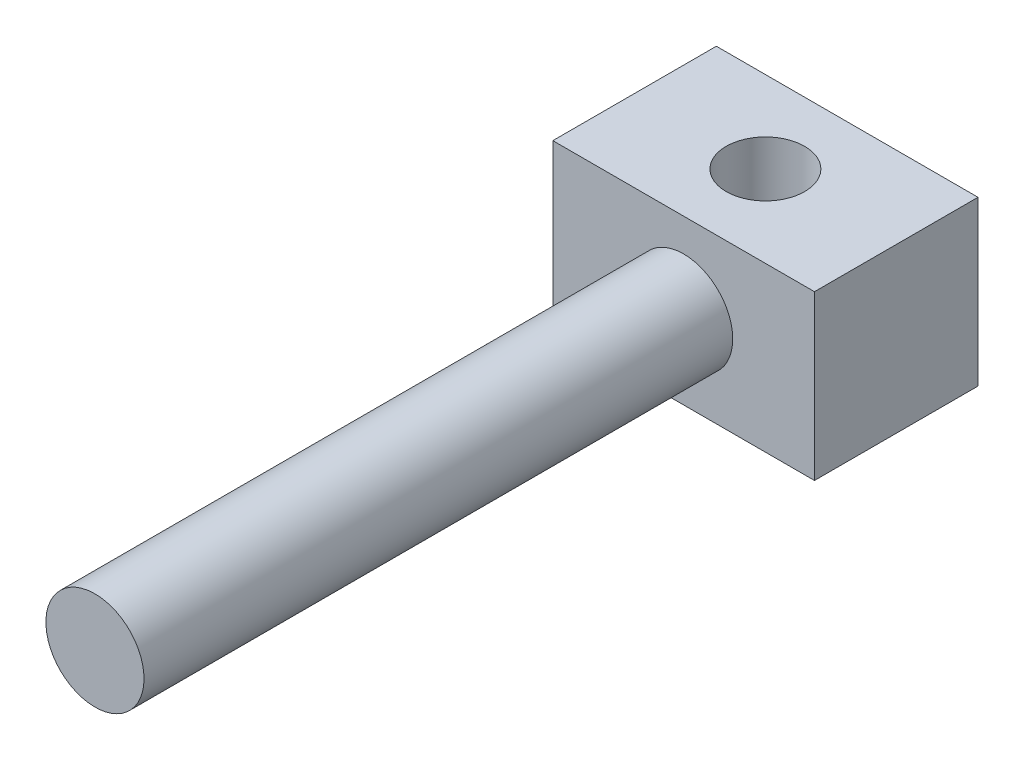
ISO-10303-21;
HEADER;
FILE_DESCRIPTION(('STEP AP214'),'2;1');
FILE_NAME('part.step','',(''),(''),'','','');
FILE_SCHEMA(('AUTOMOTIVE_DESIGN { 1 0 10303 214 1 1 1 1 }'));
ENDSEC;
DATA;
#1=APPLICATION_CONTEXT('core data for automotive mechanical design processes');
#2=APPLICATION_PROTOCOL_DEFINITION('international standard','automotive_design',2000,#1);
#3=PRODUCT_CONTEXT('',#1,'mechanical');
#4=PRODUCT('Part','Part','',(#3));
#5=PRODUCT_RELATED_PRODUCT_CATEGORY('part','',(#4));
#6=PRODUCT_DEFINITION_FORMATION('','',#4);
#7=PRODUCT_DEFINITION_CONTEXT('part definition',#1,'design');
#8=PRODUCT_DEFINITION('design','',#6,#7);
#9=PRODUCT_DEFINITION_SHAPE('','',#8);
#10=(LENGTH_UNIT() NAMED_UNIT(*) SI_UNIT(.MILLI.,.METRE.));
#11=(NAMED_UNIT(*) PLANE_ANGLE_UNIT() SI_UNIT($,.RADIAN.));
#12=(NAMED_UNIT(*) SI_UNIT($,.STERADIAN.) SOLID_ANGLE_UNIT());
#13=UNCERTAINTY_MEASURE_WITH_UNIT(LENGTH_MEASURE(1.E-05),#10,'distance_accuracy_value','');
#14=(GEOMETRIC_REPRESENTATION_CONTEXT(3) GLOBAL_UNCERTAINTY_ASSIGNED_CONTEXT((#13)) GLOBAL_UNIT_ASSIGNED_CONTEXT((#10,
#11,#12)) REPRESENTATION_CONTEXT('',''));
#15=CARTESIAN_POINT('',(0.,0.,0.));
#16=DIRECTION('',(0.,0.,1.));
#17=DIRECTION('',(1.,0.,0.));
#18=AXIS2_PLACEMENT_3D('',#15,#16,#17);
#19=CARTESIAN_POINT('',(-4.,2.5,2.5));
#20=DIRECTION('',(0.,0.,-1.));
#21=DIRECTION('',(-1.,0.,0.));
#22=AXIS2_PLACEMENT_3D('',#19,#20,#21);
#23=PLANE('',#22);
#24=CARTESIAN_POINT('',(0.,0.,2.5));
#25=DIRECTION('',(0.,0.,-1.));
#26=DIRECTION('',(-1.,0.,0.));
#27=AXIS2_PLACEMENT_3D('',#24,#25,#26);
#28=CIRCLE('',#27,1.5);
#29=CARTESIAN_POINT('',(-1.5,0.,2.5));
#30=VERTEX_POINT('',#29);
#31=EDGE_CURVE('E151',#30,#30,#28,.F.);
#32=ORIENTED_EDGE('',*,*,#31,.F.);
#33=EDGE_LOOP('',(#32));
#34=FACE_BOUND('',#33,.T.);
#35=DIRECTION('',(1.,0.,0.));
#36=VECTOR('',#35,1.);
#37=CARTESIAN_POINT('',(-4.,-2.5,2.5));
#38=LINE('',#37,#36);
#39=CARTESIAN_POINT('',(-4.,-2.5,2.5));
#40=VERTEX_POINT('',#39);
#41=CARTESIAN_POINT('',(4.00000000000001,-2.5,2.5));
#42=VERTEX_POINT('',#41);
#43=EDGE_CURVE('E147',#40,#42,#38,.T.);
#44=ORIENTED_EDGE('',*,*,#43,.T.);
#45=DIRECTION('',(0.,-1.,0.));
#46=VECTOR('',#45,1.);
#47=CARTESIAN_POINT('',(4.00000000000001,2.5,2.5));
#48=LINE('',#47,#46);
#49=CARTESIAN_POINT('',(4.00000000000001,2.5,2.5));
#50=VERTEX_POINT('',#49);
#51=EDGE_CURVE('E12',#50,#42,#48,.T.);
#52=ORIENTED_EDGE('',*,*,#51,.F.);
#53=DIRECTION('',(1.,0.,0.));
#54=VECTOR('',#53,1.);
#55=CARTESIAN_POINT('',(-4.,2.5,2.5));
#56=LINE('',#55,#54);
#57=CARTESIAN_POINT('',(-4.,2.5,2.5));
#58=VERTEX_POINT('',#57);
#59=EDGE_CURVE('E131',#58,#50,#56,.T.);
#60=ORIENTED_EDGE('',*,*,#59,.F.);
#61=DIRECTION('',(0.,-1.,0.));
#62=VECTOR('',#61,1.);
#63=CARTESIAN_POINT('',(-4.,2.5,2.5));
#64=LINE('',#63,#62);
#65=EDGE_CURVE('E143',#58,#40,#64,.T.);
#66=ORIENTED_EDGE('',*,*,#65,.T.);
#67=EDGE_LOOP('',(#44,#52,#60,#66));
#68=FACE_BOUND('',#67,.T.);
#69=ADVANCED_FACE('F79',(#34,#68),#23,.F.);
#70=CARTESIAN_POINT('',(4.,2.5,-2.5));
#71=DIRECTION('',(-1.,0.,0.));
#72=DIRECTION('',(0.,0.,1.));
#73=AXIS2_PLACEMENT_3D('',#70,#71,#72);
#74=PLANE('',#73);
#75=DIRECTION('',(0.,0.,-1.));
#76=VECTOR('',#75,1.);
#77=CARTESIAN_POINT('',(4.,-2.5,-2.5));
#78=LINE('',#77,#76);
#79=CARTESIAN_POINT('',(4.,-2.5,-2.5));
#80=VERTEX_POINT('',#79);
#81=EDGE_CURVE('E136',#42,#80,#78,.T.);
#82=ORIENTED_EDGE('',*,*,#81,.T.);
#83=DIRECTION('',(0.,-1.,0.));
#84=VECTOR('',#83,1.);
#85=CARTESIAN_POINT('',(4.,2.5,-2.5));
#86=LINE('',#85,#84);
#87=CARTESIAN_POINT('',(4.,2.5,-2.5));
#88=VERTEX_POINT('',#87);
#89=EDGE_CURVE('E88',#88,#80,#86,.T.);
#90=ORIENTED_EDGE('',*,*,#89,.F.);
#91=DIRECTION('',(0.,0.,-1.));
#92=VECTOR('',#91,1.);
#93=CARTESIAN_POINT('',(4.,2.5,-2.5));
#94=LINE('',#93,#92);
#95=EDGE_CURVE('E126',#50,#88,#94,.T.);
#96=ORIENTED_EDGE('',*,*,#95,.F.);
#97=ORIENTED_EDGE('',*,*,#51,.T.);
#98=EDGE_LOOP('',(#82,#90,#96,#97));
#99=FACE_BOUND('',#98,.T.);
#100=ADVANCED_FACE('F135',(#99),#74,.F.);
#101=CARTESIAN_POINT('',(-4.,2.5,-2.5));
#102=DIRECTION('',(0.,0.,1.));
#103=DIRECTION('',(1.,0.,0.));
#104=AXIS2_PLACEMENT_3D('',#101,#102,#103);
#105=PLANE('',#104);
#106=DIRECTION('',(-1.,0.,0.));
#107=VECTOR('',#106,1.);
#108=CARTESIAN_POINT('',(-4.,-2.5,-2.5));
#109=LINE('',#108,#107);
#110=CARTESIAN_POINT('',(-4.,-2.5,-2.5));
#111=VERTEX_POINT('',#110);
#112=EDGE_CURVE('E113',#80,#111,#109,.T.);
#113=ORIENTED_EDGE('',*,*,#112,.T.);
#114=DIRECTION('',(0.,-1.,0.));
#115=VECTOR('',#114,1.);
#116=CARTESIAN_POINT('',(-4.,2.5,-2.5));
#117=LINE('',#116,#115);
#118=CARTESIAN_POINT('',(-4.,2.5,-2.5));
#119=VERTEX_POINT('',#118);
#120=EDGE_CURVE('E138',#119,#111,#117,.T.);
#121=ORIENTED_EDGE('',*,*,#120,.F.);
#122=DIRECTION('',(-1.,0.,0.));
#123=VECTOR('',#122,1.);
#124=CARTESIAN_POINT('',(-4.,2.5,-2.5));
#125=LINE('',#124,#123);
#126=EDGE_CURVE('E129',#88,#119,#125,.T.);
#127=ORIENTED_EDGE('',*,*,#126,.F.);
#128=ORIENTED_EDGE('',*,*,#89,.T.);
#129=EDGE_LOOP('',(#113,#121,#127,#128));
#130=FACE_BOUND('',#129,.T.);
#131=ADVANCED_FACE('F139',(#130),#105,.F.);
#132=CARTESIAN_POINT('',(-4.,2.5,2.5));
#133=DIRECTION('',(1.,0.,0.));
#134=DIRECTION('',(0.,0.,-1.));
#135=AXIS2_PLACEMENT_3D('',#132,#133,#134);
#136=PLANE('',#135);
#137=DIRECTION('',(0.,0.,1.));
#138=VECTOR('',#137,1.);
#139=CARTESIAN_POINT('',(-4.,-2.5,2.5));
#140=LINE('',#139,#138);
#141=EDGE_CURVE('E119',#111,#40,#140,.T.);
#142=ORIENTED_EDGE('',*,*,#141,.T.);
#143=ORIENTED_EDGE('',*,*,#65,.F.);
#144=DIRECTION('',(0.,0.,1.));
#145=VECTOR('',#144,1.);
#146=CARTESIAN_POINT('',(-4.,2.5,2.5));
#147=LINE('',#146,#145);
#148=EDGE_CURVE('E96',#119,#58,#147,.T.);
#149=ORIENTED_EDGE('',*,*,#148,.F.);
#150=ORIENTED_EDGE('',*,*,#120,.T.);
#151=EDGE_LOOP('',(#142,#143,#149,#150));
#152=FACE_BOUND('',#151,.T.);
#153=ADVANCED_FACE('F161',(#152),#136,.F.);
#154=CARTESIAN_POINT('',(0.,2.5,0.));
#155=DIRECTION('',(0.,-1.,0.));
#156=DIRECTION('',(0.,0.,-1.));
#157=AXIS2_PLACEMENT_3D('',#154,#155,#156);
#158=PLANE('',#157);
#159=CARTESIAN_POINT('',(0.,2.5,0.));
#160=DIRECTION('',(0.,1.,0.));
#161=DIRECTION('',(0.,0.,1.));
#162=AXIS2_PLACEMENT_3D('',#159,#160,#161);
#163=CIRCLE('',#162,1.2);
#164=CARTESIAN_POINT('',(0.,2.5,1.2));
#165=VERTEX_POINT('',#164);
#166=EDGE_CURVE('E172',#165,#165,#163,.T.);
#167=ORIENTED_EDGE('',*,*,#166,.F.);
#168=EDGE_LOOP('',(#167));
#169=FACE_BOUND('',#168,.T.);
#170=ORIENTED_EDGE('',*,*,#59,.T.);
#171=ORIENTED_EDGE('',*,*,#95,.T.);
#172=ORIENTED_EDGE('',*,*,#126,.T.);
#173=ORIENTED_EDGE('',*,*,#148,.T.);
#174=EDGE_LOOP('',(#170,#171,#172,#173));
#175=FACE_BOUND('',#174,.T.);
#176=ADVANCED_FACE('F127',(#169,#175),#158,.F.);
#177=CARTESIAN_POINT('',(0.,-2.5,0.));
#178=DIRECTION('',(0.,-1.,0.));
#179=DIRECTION('',(0.,0.,-1.));
#180=AXIS2_PLACEMENT_3D('',#177,#178,#179);
#181=PLANE('',#180);
#182=CARTESIAN_POINT('',(0.,-2.5,0.));
#183=DIRECTION('',(0.,1.,0.));
#184=DIRECTION('',(0.,0.,1.));
#185=AXIS2_PLACEMENT_3D('',#182,#183,#184);
#186=CIRCLE('',#185,1.2);
#187=CARTESIAN_POINT('',(0.,-2.5,1.2));
#188=VERTEX_POINT('',#187);
#189=EDGE_CURVE('E171',#188,#188,#186,.T.);
#190=ORIENTED_EDGE('',*,*,#189,.T.);
#191=EDGE_LOOP('',(#190));
#192=FACE_BOUND('',#191,.T.);
#193=ORIENTED_EDGE('',*,*,#43,.F.);
#194=ORIENTED_EDGE('',*,*,#141,.F.);
#195=ORIENTED_EDGE('',*,*,#112,.F.);
#196=ORIENTED_EDGE('',*,*,#81,.F.);
#197=EDGE_LOOP('',(#193,#194,#195,#196));
#198=FACE_BOUND('',#197,.T.);
#199=ADVANCED_FACE('F164',(#192,#198),#181,.T.);
#200=CARTESIAN_POINT('',(0.,0.,0.378679656440354));
#201=DIRECTION('',(0.,0.,1.));
#202=DIRECTION('',(1.,0.,0.));
#203=AXIS2_PLACEMENT_3D('',#200,#201,#202);
#204=CYLINDRICAL_SURFACE('',#203,1.5);
#205=ORIENTED_EDGE('',*,*,#31,.T.);
#206=EDGE_LOOP('',(#205));
#207=FACE_BOUND('',#206,.T.);
#208=CARTESIAN_POINT('',(0.,0.,20.5));
#209=DIRECTION('',(0.,0.,1.));
#210=DIRECTION('',(1.,0.,0.));
#211=AXIS2_PLACEMENT_3D('',#208,#209,#210);
#212=CIRCLE('',#211,1.5);
#213=CARTESIAN_POINT('',(1.5,0.,20.5));
#214=VERTEX_POINT('',#213);
#215=EDGE_CURVE('E176',#214,#214,#212,.T.);
#216=ORIENTED_EDGE('',*,*,#215,.F.);
#217=EDGE_LOOP('',(#216));
#218=FACE_BOUND('',#217,.T.);
#219=ADVANCED_FACE('F186',(#207,#218),#204,.T.);
#220=CARTESIAN_POINT('',(0.,-2.5,0.));
#221=DIRECTION('',(0.,1.,0.));
#222=DIRECTION('',(0.,0.,1.));
#223=AXIS2_PLACEMENT_3D('',#220,#221,#222);
#224=CYLINDRICAL_SURFACE('',#223,1.2);
#225=ORIENTED_EDGE('',*,*,#189,.F.);
#226=EDGE_LOOP('',(#225));
#227=FACE_BOUND('',#226,.T.);
#228=ORIENTED_EDGE('',*,*,#166,.T.);
#229=EDGE_LOOP('',(#228));
#230=FACE_BOUND('',#229,.T.);
#231=ADVANCED_FACE('F188',(#227,#230),#224,.F.);
#232=CARTESIAN_POINT('',(0.,0.,20.5));
#233=DIRECTION('',(0.,0.,1.));
#234=DIRECTION('',(1.,0.,0.));
#235=AXIS2_PLACEMENT_3D('',#232,#233,#234);
#236=PLANE('',#235);
#237=ORIENTED_EDGE('',*,*,#215,.T.);
#238=EDGE_LOOP('',(#237));
#239=FACE_BOUND('',#238,.T.);
#240=ADVANCED_FACE('F184',(#239),#236,.T.);
#241=CLOSED_SHELL('',(#69,#100,#131,#153,#176,#199,#219,#231,#240));
#242=MANIFOLD_SOLID_BREP('B2',#241);
#243=ADVANCED_BREP_SHAPE_REPRESENTATION('',(#18,#242),#14);
#244=SHAPE_DEFINITION_REPRESENTATION(#9,#243);
ENDSEC;
END-ISO-10303-21;
